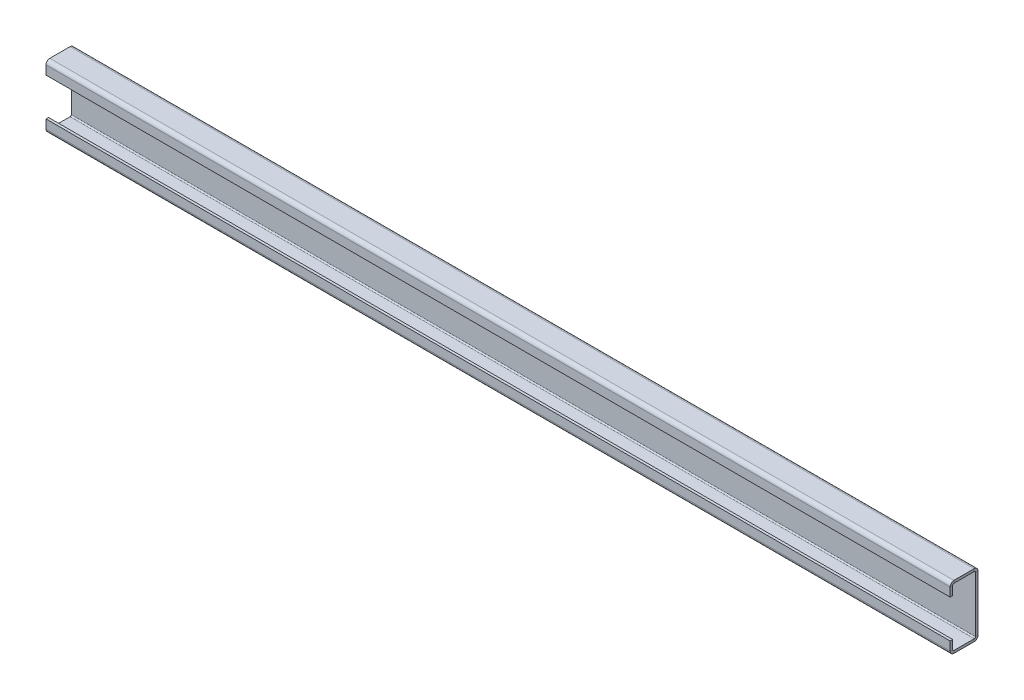
ISO-10303-21;
HEADER;
FILE_DESCRIPTION(('STEP AP214'),'2;1');
FILE_NAME('part.step','',(''),(''),'','','');
FILE_SCHEMA(('AUTOMOTIVE_DESIGN { 1 0 10303 214 1 1 1 1 }'));
ENDSEC;
DATA;
#1=APPLICATION_CONTEXT('core data for automotive mechanical design processes');
#2=APPLICATION_PROTOCOL_DEFINITION('international standard','automotive_design',2000,#1);
#3=PRODUCT_CONTEXT('',#1,'mechanical');
#4=PRODUCT('Part','Part','',(#3));
#5=PRODUCT_RELATED_PRODUCT_CATEGORY('part','',(#4));
#6=PRODUCT_DEFINITION_FORMATION('','',#4);
#7=PRODUCT_DEFINITION_CONTEXT('part definition',#1,'design');
#8=PRODUCT_DEFINITION('design','',#6,#7);
#9=PRODUCT_DEFINITION_SHAPE('','',#8);
#10=(LENGTH_UNIT() NAMED_UNIT(*) SI_UNIT(.MILLI.,.METRE.));
#11=(NAMED_UNIT(*) PLANE_ANGLE_UNIT() SI_UNIT($,.RADIAN.));
#12=(NAMED_UNIT(*) SI_UNIT($,.STERADIAN.) SOLID_ANGLE_UNIT());
#13=UNCERTAINTY_MEASURE_WITH_UNIT(LENGTH_MEASURE(1.E-05),#10,'distance_accuracy_value','');
#14=(GEOMETRIC_REPRESENTATION_CONTEXT(3) GLOBAL_UNCERTAINTY_ASSIGNED_CONTEXT((#13)) GLOBAL_UNIT_ASSIGNED_CONTEXT((#10,
#11,#12)) REPRESENTATION_CONTEXT('',''));
#15=CARTESIAN_POINT('',(0.,0.,0.));
#16=DIRECTION('',(0.,0.,1.));
#17=DIRECTION('',(1.,0.,0.));
#18=AXIS2_PLACEMENT_3D('',#15,#16,#17);
#19=CARTESIAN_POINT('',(357.5,-24.9999999999999,1.99999999999999));
#20=DIRECTION('',(-1.,0.,0.));
#21=DIRECTION('',(0.,-1.,0.));
#22=AXIS2_PLACEMENT_3D('',#19,#20,#21);
#23=PLANE('',#22);
#24=DIRECTION('',(0.,-1.,0.));
#25=VECTOR('',#24,1.);
#26=CARTESIAN_POINT('',(357.5,-23.,19.));
#27=LINE('',#26,#25);
#28=CARTESIAN_POINT('',(357.5,-23.,19.));
#29=VERTEX_POINT('',#28);
#30=CARTESIAN_POINT('',(357.5,-25.,19.));
#31=VERTEX_POINT('',#30);
#32=EDGE_CURVE('E311',#29,#31,#27,.T.);
#33=ORIENTED_EDGE('',*,*,#32,.T.);
#34=DIRECTION('',(0.,0.,-1.));
#35=VECTOR('',#34,1.);
#36=CARTESIAN_POINT('',(357.5,-24.9999999999998,0.));
#37=LINE('',#36,#35);
#38=CARTESIAN_POINT('',(357.5,-24.9999999999999,3.00000000000002));
#39=VERTEX_POINT('',#38);
#40=EDGE_CURVE('E377',#39,#31,#37,.F.);
#41=ORIENTED_EDGE('',*,*,#40,.F.);
#42=DIRECTION('',(0.,1.,0.));
#43=VECTOR('',#42,1.);
#44=CARTESIAN_POINT('',(357.5,-22.9999999999999,3.00000000000003));
#45=LINE('',#44,#43);
#46=CARTESIAN_POINT('',(357.5,-23.,3.00000000000001));
#47=VERTEX_POINT('',#46);
#48=EDGE_CURVE('E388',#47,#39,#45,.F.);
#49=ORIENTED_EDGE('',*,*,#48,.F.);
#50=DIRECTION('',(0.,0.,1.));
#51=VECTOR('',#50,1.);
#52=CARTESIAN_POINT('',(357.5,-22.9999999999999,2.));
#53=LINE('',#52,#51);
#54=EDGE_CURVE('E382',#47,#29,#53,.T.);
#55=ORIENTED_EDGE('',*,*,#54,.T.);
#56=EDGE_LOOP('',(#33,#41,#49,#55));
#57=FACE_BOUND('',#56,.T.);
#58=ADVANCED_FACE('F119',(#57),#23,.F.);
#59=CARTESIAN_POINT('',(-357.5,-25.,22.));
#60=DIRECTION('',(1.,0.,0.));
#61=DIRECTION('',(0.,1.,0.));
#62=AXIS2_PLACEMENT_3D('',#59,#60,#61);
#63=PLANE('',#62);
#64=DIRECTION('',(0.,-1.,0.));
#65=VECTOR('',#64,1.);
#66=CARTESIAN_POINT('',(-357.5,-23.,19.));
#67=LINE('',#66,#65);
#68=CARTESIAN_POINT('',(-357.5,-23.,19.));
#69=VERTEX_POINT('',#68);
#70=CARTESIAN_POINT('',(-357.5,-25.,19.));
#71=VERTEX_POINT('',#70);
#72=EDGE_CURVE('E318',#69,#71,#67,.T.);
#73=ORIENTED_EDGE('',*,*,#72,.F.);
#74=DIRECTION('',(0.,0.,-1.));
#75=VECTOR('',#74,1.);
#76=CARTESIAN_POINT('',(-357.5,-23.,22.));
#77=LINE('',#76,#75);
#78=CARTESIAN_POINT('',(-357.5,-23.,3.00000000000001));
#79=VERTEX_POINT('',#78);
#80=EDGE_CURVE('E380',#69,#79,#77,.T.);
#81=ORIENTED_EDGE('',*,*,#80,.T.);
#82=DIRECTION('',(0.,1.,0.));
#83=VECTOR('',#82,1.);
#84=CARTESIAN_POINT('',(-357.5,-25.,2.99999999999999));
#85=LINE('',#84,#83);
#86=CARTESIAN_POINT('',(-357.5,-25.,3.00000000000001));
#87=VERTEX_POINT('',#86);
#88=EDGE_CURVE('E371',#79,#87,#85,.F.);
#89=ORIENTED_EDGE('',*,*,#88,.T.);
#90=DIRECTION('',(0.,0.,1.));
#91=VECTOR('',#90,1.);
#92=CARTESIAN_POINT('',(-357.5,-25.,0.));
#93=LINE('',#92,#91);
#94=EDGE_CURVE('E374',#71,#87,#93,.F.);
#95=ORIENTED_EDGE('',*,*,#94,.F.);
#96=EDGE_LOOP('',(#73,#81,#89,#95));
#97=FACE_BOUND('',#96,.T.);
#98=ADVANCED_FACE('F547',(#97),#63,.F.);
#99=CARTESIAN_POINT('',(0.,-24.9999999999999,0.));
#100=DIRECTION('',(0.,-1.,0.));
#101=DIRECTION('',(0.,0.,-1.));
#102=AXIS2_PLACEMENT_3D('',#99,#100,#101);
#103=PLANE('',#102);
#104=ORIENTED_EDGE('',*,*,#40,.T.);
#105=DIRECTION('',(1.,0.,0.));
#106=VECTOR('',#105,1.);
#107=CARTESIAN_POINT('',(357.5,-25.,19.));
#108=LINE('',#107,#106);
#109=EDGE_CURVE('E262',#31,#71,#108,.F.);
#110=ORIENTED_EDGE('',*,*,#109,.T.);
#111=ORIENTED_EDGE('',*,*,#94,.T.);
#112=DIRECTION('',(1.,0.,0.));
#113=VECTOR('',#112,1.);
#114=CARTESIAN_POINT('',(0.,-24.9999999999999,3.00000000000001));
#115=LINE('',#114,#113);
#116=EDGE_CURVE('E385',#87,#39,#115,.T.);
#117=ORIENTED_EDGE('',*,*,#116,.T.);
#118=EDGE_LOOP('',(#104,#110,#111,#117));
#119=FACE_BOUND('',#118,.T.);
#120=ADVANCED_FACE('F553',(#119),#103,.T.);
#121=CARTESIAN_POINT('',(0.,-22.9999999999999,0.));
#122=DIRECTION('',(0.,-1.,0.));
#123=DIRECTION('',(0.,0.,-1.));
#124=AXIS2_PLACEMENT_3D('',#121,#122,#123);
#125=PLANE('',#124);
#126=DIRECTION('',(1.,0.,0.));
#127=VECTOR('',#126,1.);
#128=CARTESIAN_POINT('',(357.5,-23.,19.));
#129=LINE('',#128,#127);
#130=EDGE_CURVE('E315',#29,#69,#129,.F.);
#131=ORIENTED_EDGE('',*,*,#130,.F.);
#132=ORIENTED_EDGE('',*,*,#54,.F.);
#133=DIRECTION('',(-1.,0.,0.));
#134=VECTOR('',#133,1.);
#135=CARTESIAN_POINT('',(-357.5,-23.,3.));
#136=LINE('',#135,#134);
#137=EDGE_CURVE('E391',#79,#47,#136,.F.);
#138=ORIENTED_EDGE('',*,*,#137,.F.);
#139=ORIENTED_EDGE('',*,*,#80,.F.);
#140=EDGE_LOOP('',(#131,#132,#138,#139));
#141=FACE_BOUND('',#140,.T.);
#142=ADVANCED_FACE('F582',(#141),#125,.F.);
#143=CARTESIAN_POINT('',(-357.5,25.,1.99999999999999));
#144=DIRECTION('',(1.,0.,0.));
#145=DIRECTION('',(0.,1.,0.));
#146=AXIS2_PLACEMENT_3D('',#143,#144,#145);
#147=PLANE('',#146);
#148=DIRECTION('',(0.,1.,0.));
#149=VECTOR('',#148,1.);
#150=CARTESIAN_POINT('',(-357.5,23.0000000000001,19.));
#151=LINE('',#150,#149);
#152=CARTESIAN_POINT('',(-357.5,23.0000000000001,19.));
#153=VERTEX_POINT('',#152);
#154=CARTESIAN_POINT('',(-357.5,25.0000000000001,19.));
#155=VERTEX_POINT('',#154);
#156=EDGE_CURVE('E359',#153,#155,#151,.T.);
#157=ORIENTED_EDGE('',*,*,#156,.T.);
#158=DIRECTION('',(0.,0.,-1.));
#159=VECTOR('',#158,1.);
#160=CARTESIAN_POINT('',(-357.5,25.,0.));
#161=LINE('',#160,#159);
#162=CARTESIAN_POINT('',(-357.5,25.,3.00000000000002));
#163=VERTEX_POINT('',#162);
#164=EDGE_CURVE('E421',#163,#155,#161,.F.);
#165=ORIENTED_EDGE('',*,*,#164,.F.);
#166=DIRECTION('',(0.,-1.,0.));
#167=VECTOR('',#166,1.);
#168=CARTESIAN_POINT('',(-357.5,23.,3.00000000000003));
#169=LINE('',#168,#167);
#170=CARTESIAN_POINT('',(-357.5,23.0000000000001,3.00000000000001));
#171=VERTEX_POINT('',#170);
#172=EDGE_CURVE('E432',#171,#163,#169,.F.);
#173=ORIENTED_EDGE('',*,*,#172,.F.);
#174=DIRECTION('',(0.,0.,1.));
#175=VECTOR('',#174,1.);
#176=CARTESIAN_POINT('',(-357.5,23.,2.));
#177=LINE('',#176,#175);
#178=EDGE_CURVE('E426',#171,#153,#177,.T.);
#179=ORIENTED_EDGE('',*,*,#178,.T.);
#180=EDGE_LOOP('',(#157,#165,#173,#179));
#181=FACE_BOUND('',#180,.T.);
#182=ADVANCED_FACE('F505',(#181),#147,.F.);
#183=CARTESIAN_POINT('',(357.5,25.0000000000001,22.));
#184=DIRECTION('',(-1.,0.,0.));
#185=DIRECTION('',(0.,-1.,0.));
#186=AXIS2_PLACEMENT_3D('',#183,#184,#185);
#187=PLANE('',#186);
#188=DIRECTION('',(0.,1.,0.));
#189=VECTOR('',#188,1.);
#190=CARTESIAN_POINT('',(357.5,23.0000000000001,19.));
#191=LINE('',#190,#189);
#192=CARTESIAN_POINT('',(357.5,23.0000000000001,19.));
#193=VERTEX_POINT('',#192);
#194=CARTESIAN_POINT('',(357.5,25.0000000000001,19.));
#195=VERTEX_POINT('',#194);
#196=EDGE_CURVE('E369',#193,#195,#191,.T.);
#197=ORIENTED_EDGE('',*,*,#196,.F.);
#198=DIRECTION('',(0.,0.,-1.));
#199=VECTOR('',#198,1.);
#200=CARTESIAN_POINT('',(357.5,23.0000000000001,22.));
#201=LINE('',#200,#199);
#202=CARTESIAN_POINT('',(357.5,23.0000000000001,3.00000000000001));
#203=VERTEX_POINT('',#202);
#204=EDGE_CURVE('E424',#193,#203,#201,.T.);
#205=ORIENTED_EDGE('',*,*,#204,.T.);
#206=DIRECTION('',(0.,-1.,0.));
#207=VECTOR('',#206,1.);
#208=CARTESIAN_POINT('',(357.5,25.0000000000001,2.99999999999999));
#209=LINE('',#208,#207);
#210=CARTESIAN_POINT('',(357.5,25.0000000000001,3.00000000000001));
#211=VERTEX_POINT('',#210);
#212=EDGE_CURVE('E415',#203,#211,#209,.F.);
#213=ORIENTED_EDGE('',*,*,#212,.T.);
#214=DIRECTION('',(0.,0.,1.));
#215=VECTOR('',#214,1.);
#216=CARTESIAN_POINT('',(357.5,25.0000000000001,0.));
#217=LINE('',#216,#215);
#218=EDGE_CURVE('E418',#195,#211,#217,.F.);
#219=ORIENTED_EDGE('',*,*,#218,.F.);
#220=EDGE_LOOP('',(#197,#205,#213,#219));
#221=FACE_BOUND('',#220,.T.);
#222=ADVANCED_FACE('F497',(#221),#187,.F.);
#223=CARTESIAN_POINT('',(0.,25.,0.));
#224=DIRECTION('',(0.,1.,0.));
#225=DIRECTION('',(0.,0.,1.));
#226=AXIS2_PLACEMENT_3D('',#223,#224,#225);
#227=PLANE('',#226);
#228=ORIENTED_EDGE('',*,*,#164,.T.);
#229=DIRECTION('',(-1.,0.,0.));
#230=VECTOR('',#229,1.);
#231=CARTESIAN_POINT('',(-357.5,25.0000000000001,19.));
#232=LINE('',#231,#230);
#233=EDGE_CURVE('E354',#155,#195,#232,.F.);
#234=ORIENTED_EDGE('',*,*,#233,.T.);
#235=ORIENTED_EDGE('',*,*,#218,.T.);
#236=DIRECTION('',(-1.,0.,0.));
#237=VECTOR('',#236,1.);
#238=CARTESIAN_POINT('',(0.,25.,3.00000000000001));
#239=LINE('',#238,#237);
#240=EDGE_CURVE('E429',#211,#163,#239,.T.);
#241=ORIENTED_EDGE('',*,*,#240,.T.);
#242=EDGE_LOOP('',(#228,#234,#235,#241));
#243=FACE_BOUND('',#242,.T.);
#244=ADVANCED_FACE('F507',(#243),#227,.T.);
#245=CARTESIAN_POINT('',(0.,23.,0.));
#246=DIRECTION('',(0.,1.,0.));
#247=DIRECTION('',(0.,0.,1.));
#248=AXIS2_PLACEMENT_3D('',#245,#246,#247);
#249=PLANE('',#248);
#250=DIRECTION('',(-1.,0.,0.));
#251=VECTOR('',#250,1.);
#252=CARTESIAN_POINT('',(-357.5,23.0000000000001,19.));
#253=LINE('',#252,#251);
#254=EDGE_CURVE('E365',#153,#193,#253,.F.);
#255=ORIENTED_EDGE('',*,*,#254,.F.);
#256=ORIENTED_EDGE('',*,*,#178,.F.);
#257=DIRECTION('',(1.,0.,0.));
#258=VECTOR('',#257,1.);
#259=CARTESIAN_POINT('',(357.5,23.0000000000001,3.));
#260=LINE('',#259,#258);
#261=EDGE_CURVE('E435',#203,#171,#260,.F.);
#262=ORIENTED_EDGE('',*,*,#261,.F.);
#263=ORIENTED_EDGE('',*,*,#204,.F.);
#264=EDGE_LOOP('',(#255,#256,#262,#263));
#265=FACE_BOUND('',#264,.T.);
#266=ADVANCED_FACE('F501',(#265),#249,.F.);
#267=CARTESIAN_POINT('',(-357.5,25.,2.));
#268=DIRECTION('',(1.,0.,0.));
#269=DIRECTION('',(0.,1.,0.));
#270=AXIS2_PLACEMENT_3D('',#267,#268,#269);
#271=PLANE('',#270);
#272=DIRECTION('',(0.,0.,-1.));
#273=VECTOR('',#272,1.);
#274=CARTESIAN_POINT('',(-357.5,-21.9999999999999,1.99999999999996));
#275=LINE('',#274,#273);
#276=CARTESIAN_POINT('',(-357.5,-21.9999999999999,1.99999999999996));
#277=VERTEX_POINT('',#276);
#278=CARTESIAN_POINT('',(-357.5,-21.9999999999998,0.));
#279=VERTEX_POINT('',#278);
#280=EDGE_CURVE('E412',#277,#279,#275,.T.);
#281=ORIENTED_EDGE('',*,*,#280,.F.);
#282=DIRECTION('',(0.,-1.,0.));
#283=VECTOR('',#282,1.);
#284=CARTESIAN_POINT('',(-357.5,25.,2.));
#285=LINE('',#284,#283);
#286=CARTESIAN_POINT('',(-357.5,22.,1.99999999999996));
#287=VERTEX_POINT('',#286);
#288=EDGE_CURVE('E128',#287,#277,#285,.T.);
#289=ORIENTED_EDGE('',*,*,#288,.F.);
#290=DIRECTION('',(0.,0.,-1.));
#291=VECTOR('',#290,1.);
#292=CARTESIAN_POINT('',(-357.5,22.,1.99999999999996));
#293=LINE('',#292,#291);
#294=CARTESIAN_POINT('',(-357.5,21.9999999999999,0.));
#295=VERTEX_POINT('',#294);
#296=EDGE_CURVE('E446',#287,#295,#293,.T.);
#297=ORIENTED_EDGE('',*,*,#296,.T.);
#298=DIRECTION('',(0.,-1.,0.));
#299=VECTOR('',#298,1.);
#300=CARTESIAN_POINT('',(-357.5,25.,0.));
#301=LINE('',#300,#299);
#302=EDGE_CURVE('E459',#295,#279,#301,.T.);
#303=ORIENTED_EDGE('',*,*,#302,.T.);
#304=EDGE_LOOP('',(#281,#289,#297,#303));
#305=FACE_BOUND('',#304,.T.);
#306=ADVANCED_FACE('F121',(#305),#271,.F.);
#307=CARTESIAN_POINT('',(357.5,25.0000000000001,2.));
#308=DIRECTION('',(-1.,0.,0.));
#309=DIRECTION('',(0.,0.,1.));
#310=AXIS2_PLACEMENT_3D('',#307,#308,#309);
#311=PLANE('',#310);
#312=DIRECTION('',(0.,0.,-1.));
#313=VECTOR('',#312,1.);
#314=CARTESIAN_POINT('',(357.5,-21.9999999999999,1.99999999999996));
#315=LINE('',#314,#313);
#316=CARTESIAN_POINT('',(357.5,-21.9999999999999,1.99999999999996));
#317=VERTEX_POINT('',#316);
#318=CARTESIAN_POINT('',(357.5,-21.9999999999997,0.));
#319=VERTEX_POINT('',#318);
#320=EDGE_CURVE('E402',#317,#319,#315,.T.);
#321=ORIENTED_EDGE('',*,*,#320,.T.);
#322=DIRECTION('',(0.,1.,0.));
#323=VECTOR('',#322,1.);
#324=CARTESIAN_POINT('',(357.5,25.0000000000001,0.));
#325=LINE('',#324,#323);
#326=CARTESIAN_POINT('',(357.5,22.,0.));
#327=VERTEX_POINT('',#326);
#328=EDGE_CURVE('E123',#319,#327,#325,.T.);
#329=ORIENTED_EDGE('',*,*,#328,.T.);
#330=DIRECTION('',(0.,0.,-1.));
#331=VECTOR('',#330,1.);
#332=CARTESIAN_POINT('',(357.5,22.,1.99999999999996));
#333=LINE('',#332,#331);
#334=CARTESIAN_POINT('',(357.5,22.,1.99999999999996));
#335=VERTEX_POINT('',#334);
#336=EDGE_CURVE('E456',#335,#327,#333,.T.);
#337=ORIENTED_EDGE('',*,*,#336,.F.);
#338=DIRECTION('',(0.,1.,0.));
#339=VECTOR('',#338,1.);
#340=CARTESIAN_POINT('',(357.5,25.0000000000001,2.));
#341=LINE('',#340,#339);
#342=EDGE_CURVE('E13',#317,#335,#341,.T.);
#343=ORIENTED_EDGE('',*,*,#342,.F.);
#344=EDGE_LOOP('',(#321,#329,#337,#343));
#345=FACE_BOUND('',#344,.T.);
#346=ADVANCED_FACE('F471',(#345),#311,.F.);
#347=CARTESIAN_POINT('',(0.,0.,2.));
#348=DIRECTION('',(0.,0.,-1.));
#349=DIRECTION('',(-1.,0.,0.));
#350=AXIS2_PLACEMENT_3D('',#347,#348,#349);
#351=PLANE('',#350);
#352=DIRECTION('',(1.,0.,0.));
#353=VECTOR('',#352,1.);
#354=CARTESIAN_POINT('',(357.5,-21.9999999999999,1.99999999999996));
#355=LINE('',#354,#353);
#356=EDGE_CURVE('E408',#317,#277,#355,.F.);
#357=ORIENTED_EDGE('',*,*,#356,.F.);
#358=ORIENTED_EDGE('',*,*,#342,.T.);
#359=DIRECTION('',(-1.,0.,0.));
#360=VECTOR('',#359,1.);
#361=CARTESIAN_POINT('',(-357.5,22.,1.99999999999996));
#362=LINE('',#361,#360);
#363=EDGE_CURVE('E452',#287,#335,#362,.F.);
#364=ORIENTED_EDGE('',*,*,#363,.F.);
#365=ORIENTED_EDGE('',*,*,#288,.T.);
#366=EDGE_LOOP('',(#357,#358,#364,#365));
#367=FACE_BOUND('',#366,.T.);
#368=ADVANCED_FACE('F486',(#367),#351,.F.);
#369=CARTESIAN_POINT('',(0.,0.,0.));
#370=DIRECTION('',(0.,0.,-1.));
#371=DIRECTION('',(-1.,0.,0.));
#372=AXIS2_PLACEMENT_3D('',#369,#370,#371);
#373=PLANE('',#372);
#374=ORIENTED_EDGE('',*,*,#328,.F.);
#375=DIRECTION('',(1.,0.,0.));
#376=VECTOR('',#375,1.);
#377=CARTESIAN_POINT('',(357.5,-21.9999999999997,0.));
#378=LINE('',#377,#376);
#379=EDGE_CURVE('E395',#319,#279,#378,.F.);
#380=ORIENTED_EDGE('',*,*,#379,.T.);
#381=ORIENTED_EDGE('',*,*,#302,.F.);
#382=DIRECTION('',(-1.,0.,0.));
#383=VECTOR('',#382,1.);
#384=CARTESIAN_POINT('',(-357.5,21.9999999999999,0.));
#385=LINE('',#384,#383);
#386=EDGE_CURVE('E439',#295,#327,#385,.F.);
#387=ORIENTED_EDGE('',*,*,#386,.T.);
#388=EDGE_LOOP('',(#374,#380,#381,#387));
#389=FACE_BOUND('',#388,.T.);
#390=ADVANCED_FACE('F474',(#389),#373,.T.);
#391=CARTESIAN_POINT('',(357.5,22.,3.00000000000002));
#392=DIRECTION('',(1.,0.,0.));
#393=DIRECTION('',(0.,0.,-1.));
#394=AXIS2_PLACEMENT_3D('',#391,#392,#393);
#395=PLANE('',#394);
#396=ORIENTED_EDGE('',*,*,#212,.F.);
#397=CARTESIAN_POINT('',(357.5,22.,3.00000000000002));
#398=DIRECTION('',(-1.,0.,0.));
#399=DIRECTION('',(0.,0.,1.));
#400=AXIS2_PLACEMENT_3D('',#397,#398,#399);
#401=CIRCLE('',#400,1.00000000000006);
#402=EDGE_CURVE('E449',#335,#203,#401,.F.);
#403=ORIENTED_EDGE('',*,*,#402,.F.);
#404=ORIENTED_EDGE('',*,*,#336,.T.);
#405=CARTESIAN_POINT('',(357.5,22.,3.00000000000002));
#406=DIRECTION('',(-1.,0.,0.));
#407=DIRECTION('',(0.,0.,1.));
#408=AXIS2_PLACEMENT_3D('',#405,#406,#407);
#409=CIRCLE('',#408,3.00000000000006);
#410=EDGE_CURVE('E442',#327,#211,#409,.F.);
#411=ORIENTED_EDGE('',*,*,#410,.T.);
#412=EDGE_LOOP('',(#396,#403,#404,#411));
#413=FACE_BOUND('',#412,.T.);
#414=ADVANCED_FACE('F493',(#413),#395,.T.);
#415=CARTESIAN_POINT('',(-357.5,22.,3.00000000000002));
#416=DIRECTION('',(1.,0.,0.));
#417=DIRECTION('',(0.,0.,-1.));
#418=AXIS2_PLACEMENT_3D('',#415,#416,#417);
#419=PLANE('',#418);
#420=CARTESIAN_POINT('',(-357.5,22.,3.00000000000002));
#421=DIRECTION('',(-1.,0.,0.));
#422=DIRECTION('',(0.,0.,1.));
#423=AXIS2_PLACEMENT_3D('',#420,#421,#422);
#424=CIRCLE('',#423,1.00000000000006);
#425=EDGE_CURVE('E420',#171,#287,#424,.T.);
#426=ORIENTED_EDGE('',*,*,#425,.F.);
#427=ORIENTED_EDGE('',*,*,#172,.T.);
#428=CARTESIAN_POINT('',(-357.5,22.,3.00000000000002));
#429=DIRECTION('',(-1.,0.,0.));
#430=DIRECTION('',(0.,0.,1.));
#431=AXIS2_PLACEMENT_3D('',#428,#429,#430);
#432=CIRCLE('',#431,3.00000000000006);
#433=EDGE_CURVE('E443',#163,#295,#432,.T.);
#434=ORIENTED_EDGE('',*,*,#433,.T.);
#435=ORIENTED_EDGE('',*,*,#296,.F.);
#436=EDGE_LOOP('',(#426,#427,#434,#435));
#437=FACE_BOUND('',#436,.T.);
#438=ADVANCED_FACE('F480',(#437),#419,.F.);
#439=CARTESIAN_POINT('',(-357.5,22.,3.00000000000002));
#440=DIRECTION('',(-1.,0.,0.));
#441=DIRECTION('',(0.,1.,0.));
#442=AXIS2_PLACEMENT_3D('',#439,#440,#441);
#443=CYLINDRICAL_SURFACE('',#442,3.00000000000006);
#444=ORIENTED_EDGE('',*,*,#386,.F.);
#445=ORIENTED_EDGE('',*,*,#433,.F.);
#446=ORIENTED_EDGE('',*,*,#240,.F.);
#447=ORIENTED_EDGE('',*,*,#410,.F.);
#448=EDGE_LOOP('',(#444,#445,#446,#447));
#449=FACE_BOUND('',#448,.T.);
#450=ADVANCED_FACE('F476',(#449),#443,.T.);
#451=CARTESIAN_POINT('',(-357.5,22.,3.00000000000002));
#452=DIRECTION('',(-1.,0.,0.));
#453=DIRECTION('',(0.,1.,0.));
#454=AXIS2_PLACEMENT_3D('',#451,#452,#453);
#455=CYLINDRICAL_SURFACE('',#454,1.00000000000006);
#456=ORIENTED_EDGE('',*,*,#363,.T.);
#457=ORIENTED_EDGE('',*,*,#402,.T.);
#458=ORIENTED_EDGE('',*,*,#261,.T.);
#459=ORIENTED_EDGE('',*,*,#425,.T.);
#460=EDGE_LOOP('',(#456,#457,#458,#459));
#461=FACE_BOUND('',#460,.T.);
#462=ADVANCED_FACE('F489',(#461),#455,.F.);
#463=CARTESIAN_POINT('',(-357.5,-21.9999999999999,3.00000000000002));
#464=DIRECTION('',(-1.,0.,0.));
#465=DIRECTION('',(0.,0.,1.));
#466=AXIS2_PLACEMENT_3D('',#463,#464,#465);
#467=PLANE('',#466);
#468=ORIENTED_EDGE('',*,*,#88,.F.);
#469=CARTESIAN_POINT('',(-357.5,-21.9999999999999,3.00000000000002));
#470=DIRECTION('',(1.,0.,0.));
#471=DIRECTION('',(0.,0.,-1.));
#472=AXIS2_PLACEMENT_3D('',#469,#470,#471);
#473=CIRCLE('',#472,1.00000000000006);
#474=EDGE_CURVE('E405',#277,#79,#473,.F.);
#475=ORIENTED_EDGE('',*,*,#474,.F.);
#476=ORIENTED_EDGE('',*,*,#280,.T.);
#477=CARTESIAN_POINT('',(-357.5,-21.9999999999999,3.00000000000002));
#478=DIRECTION('',(1.,0.,0.));
#479=DIRECTION('',(0.,0.,-1.));
#480=AXIS2_PLACEMENT_3D('',#477,#478,#479);
#481=CIRCLE('',#480,3.00000000000006);
#482=EDGE_CURVE('E398',#279,#87,#481,.F.);
#483=ORIENTED_EDGE('',*,*,#482,.T.);
#484=EDGE_LOOP('',(#468,#475,#476,#483));
#485=FACE_BOUND('',#484,.T.);
#486=ADVANCED_FACE('F567',(#485),#467,.T.);
#487=CARTESIAN_POINT('',(357.5,-21.9999999999999,3.00000000000002));
#488=DIRECTION('',(-1.,0.,0.));
#489=DIRECTION('',(0.,0.,1.));
#490=AXIS2_PLACEMENT_3D('',#487,#488,#489);
#491=PLANE('',#490);
#492=CARTESIAN_POINT('',(357.5,-21.9999999999999,3.00000000000002));
#493=DIRECTION('',(1.,0.,0.));
#494=DIRECTION('',(0.,0.,-1.));
#495=AXIS2_PLACEMENT_3D('',#492,#493,#494);
#496=CIRCLE('',#495,1.00000000000006);
#497=EDGE_CURVE('E376',#47,#317,#496,.T.);
#498=ORIENTED_EDGE('',*,*,#497,.F.);
#499=ORIENTED_EDGE('',*,*,#48,.T.);
#500=CARTESIAN_POINT('',(357.5,-21.9999999999999,3.00000000000002));
#501=DIRECTION('',(1.,0.,0.));
#502=DIRECTION('',(0.,0.,-1.));
#503=AXIS2_PLACEMENT_3D('',#500,#501,#502);
#504=CIRCLE('',#503,3.00000000000006);
#505=EDGE_CURVE('E399',#39,#319,#504,.T.);
#506=ORIENTED_EDGE('',*,*,#505,.T.);
#507=ORIENTED_EDGE('',*,*,#320,.F.);
#508=EDGE_LOOP('',(#498,#499,#506,#507));
#509=FACE_BOUND('',#508,.T.);
#510=ADVANCED_FACE('F562',(#509),#491,.F.);
#511=CARTESIAN_POINT('',(357.5,-21.9999999999999,3.00000000000002));
#512=DIRECTION('',(1.,0.,0.));
#513=DIRECTION('',(0.,-1.,0.));
#514=AXIS2_PLACEMENT_3D('',#511,#512,#513);
#515=CYLINDRICAL_SURFACE('',#514,3.00000000000006);
#516=ORIENTED_EDGE('',*,*,#379,.F.);
#517=ORIENTED_EDGE('',*,*,#505,.F.);
#518=ORIENTED_EDGE('',*,*,#116,.F.);
#519=ORIENTED_EDGE('',*,*,#482,.F.);
#520=EDGE_LOOP('',(#516,#517,#518,#519));
#521=FACE_BOUND('',#520,.T.);
#522=ADVANCED_FACE('F558',(#521),#515,.T.);
#523=CARTESIAN_POINT('',(357.5,-21.9999999999999,3.00000000000002));
#524=DIRECTION('',(1.,0.,0.));
#525=DIRECTION('',(0.,-1.,0.));
#526=AXIS2_PLACEMENT_3D('',#523,#524,#525);
#527=CYLINDRICAL_SURFACE('',#526,1.00000000000006);
#528=ORIENTED_EDGE('',*,*,#356,.T.);
#529=ORIENTED_EDGE('',*,*,#474,.T.);
#530=ORIENTED_EDGE('',*,*,#137,.T.);
#531=ORIENTED_EDGE('',*,*,#497,.T.);
#532=EDGE_LOOP('',(#528,#529,#530,#531));
#533=FACE_BOUND('',#532,.T.);
#534=ADVANCED_FACE('F561',(#533),#527,.F.);
#535=CARTESIAN_POINT('',(357.5,22.0000000000001,19.));
#536=DIRECTION('',(1.,0.,0.));
#537=DIRECTION('',(0.,0.,-1.));
#538=AXIS2_PLACEMENT_3D('',#535,#536,#537);
#539=PLANE('',#538);
#540=DIRECTION('',(0.,0.,1.));
#541=VECTOR('',#540,1.);
#542=CARTESIAN_POINT('',(357.5,22.0000000000001,22.0000000000001));
#543=LINE('',#542,#541);
#544=CARTESIAN_POINT('',(357.5,22.0000000000001,20.));
#545=VERTEX_POINT('',#544);
#546=CARTESIAN_POINT('',(357.5,22.0000000000001,22.));
#547=VERTEX_POINT('',#546);
#548=EDGE_CURVE('E320',#545,#547,#543,.T.);
#549=ORIENTED_EDGE('',*,*,#548,.F.);
#550=CARTESIAN_POINT('',(357.5,22.0000000000001,19.));
#551=DIRECTION('',(-1.,0.,0.));
#552=DIRECTION('',(0.,0.,1.));
#553=AXIS2_PLACEMENT_3D('',#550,#551,#552);
#554=CIRCLE('',#553,1.);
#555=EDGE_CURVE('E362',#193,#545,#554,.F.);
#556=ORIENTED_EDGE('',*,*,#555,.F.);
#557=ORIENTED_EDGE('',*,*,#196,.T.);
#558=CARTESIAN_POINT('',(357.5,22.0000000000001,19.));
#559=DIRECTION('',(-1.,0.,0.));
#560=DIRECTION('',(0.,0.,1.));
#561=AXIS2_PLACEMENT_3D('',#558,#559,#560);
#562=CIRCLE('',#561,3.);
#563=EDGE_CURVE('E144',#195,#547,#562,.F.);
#564=ORIENTED_EDGE('',*,*,#563,.T.);
#565=EDGE_LOOP('',(#549,#556,#557,#564));
#566=FACE_BOUND('',#565,.T.);
#567=ADVANCED_FACE('F530',(#566),#539,.T.);
#568=CARTESIAN_POINT('',(-357.5,22.0000000000001,19.));
#569=DIRECTION('',(1.,0.,0.));
#570=DIRECTION('',(0.,0.,-1.));
#571=AXIS2_PLACEMENT_3D('',#568,#569,#570);
#572=PLANE('',#571);
#573=CARTESIAN_POINT('',(-357.5,22.0000000000001,19.));
#574=DIRECTION('',(-1.,0.,0.));
#575=DIRECTION('',(0.,0.,1.));
#576=AXIS2_PLACEMENT_3D('',#573,#574,#575);
#577=CIRCLE('',#576,1.);
#578=CARTESIAN_POINT('',(-357.5,22.0000000000001,20.));
#579=VERTEX_POINT('',#578);
#580=EDGE_CURVE('E324',#579,#153,#577,.T.);
#581=ORIENTED_EDGE('',*,*,#580,.F.);
#582=DIRECTION('',(0.,0.,1.));
#583=VECTOR('',#582,1.);
#584=CARTESIAN_POINT('',(-357.5,22.,20.));
#585=LINE('',#584,#583);
#586=CARTESIAN_POINT('',(-357.5,22.,22.));
#587=VERTEX_POINT('',#586);
#588=EDGE_CURVE('E347',#579,#587,#585,.T.);
#589=ORIENTED_EDGE('',*,*,#588,.T.);
#590=CARTESIAN_POINT('',(-357.5,22.0000000000001,19.));
#591=DIRECTION('',(-1.,0.,0.));
#592=DIRECTION('',(0.,0.,1.));
#593=AXIS2_PLACEMENT_3D('',#590,#591,#592);
#594=CIRCLE('',#593,3.);
#595=EDGE_CURVE('E357',#587,#155,#594,.T.);
#596=ORIENTED_EDGE('',*,*,#595,.T.);
#597=ORIENTED_EDGE('',*,*,#156,.F.);
#598=EDGE_LOOP('',(#581,#589,#596,#597));
#599=FACE_BOUND('',#598,.T.);
#600=ADVANCED_FACE('F511',(#599),#572,.F.);
#601=CARTESIAN_POINT('',(-357.5,22.0000000000001,19.));
#602=DIRECTION('',(-1.,0.,0.));
#603=DIRECTION('',(0.,0.,1.));
#604=AXIS2_PLACEMENT_3D('',#601,#602,#603);
#605=CYLINDRICAL_SURFACE('',#604,3.);
#606=ORIENTED_EDGE('',*,*,#233,.F.);
#607=ORIENTED_EDGE('',*,*,#595,.F.);
#608=DIRECTION('',(-1.,0.,0.));
#609=VECTOR('',#608,1.);
#610=CARTESIAN_POINT('',(0.,22.0000000000001,22.));
#611=LINE('',#610,#609);
#612=EDGE_CURVE('E344',#547,#587,#611,.T.);
#613=ORIENTED_EDGE('',*,*,#612,.F.);
#614=ORIENTED_EDGE('',*,*,#563,.F.);
#615=EDGE_LOOP('',(#606,#607,#613,#614));
#616=FACE_BOUND('',#615,.T.);
#617=ADVANCED_FACE('F508',(#616),#605,.T.);
#618=CARTESIAN_POINT('',(-357.5,22.0000000000001,19.));
#619=DIRECTION('',(-1.,0.,0.));
#620=DIRECTION('',(0.,0.,1.));
#621=AXIS2_PLACEMENT_3D('',#618,#619,#620);
#622=CYLINDRICAL_SURFACE('',#621,1.);
#623=ORIENTED_EDGE('',*,*,#254,.T.);
#624=ORIENTED_EDGE('',*,*,#555,.T.);
#625=DIRECTION('',(1.,0.,0.));
#626=VECTOR('',#625,1.);
#627=CARTESIAN_POINT('',(357.5,22.0000000000001,20.));
#628=LINE('',#627,#626);
#629=EDGE_CURVE('E350',#545,#579,#628,.F.);
#630=ORIENTED_EDGE('',*,*,#629,.T.);
#631=ORIENTED_EDGE('',*,*,#580,.T.);
#632=EDGE_LOOP('',(#623,#624,#630,#631));
#633=FACE_BOUND('',#632,.T.);
#634=ADVANCED_FACE('F533',(#633),#622,.F.);
#635=CARTESIAN_POINT('',(-357.5,23.,22.));
#636=DIRECTION('',(-1.,0.,0.));
#637=DIRECTION('',(0.,0.,1.));
#638=AXIS2_PLACEMENT_3D('',#635,#636,#637);
#639=PLANE('',#638);
#640=DIRECTION('',(0.,1.,0.));
#641=VECTOR('',#640,1.);
#642=CARTESIAN_POINT('',(-357.5,23.,22.));
#643=LINE('',#642,#641);
#644=CARTESIAN_POINT('',(-357.5,15.,22.0000000000001));
#645=VERTEX_POINT('',#644);
#646=EDGE_CURVE('E328',#645,#587,#643,.T.);
#647=ORIENTED_EDGE('',*,*,#646,.T.);
#648=ORIENTED_EDGE('',*,*,#588,.F.);
#649=DIRECTION('',(0.,-1.,0.));
#650=VECTOR('',#649,1.);
#651=CARTESIAN_POINT('',(-357.5,1.45716771982053E-13,20.0000000000002));
#652=LINE('',#651,#650);
#653=CARTESIAN_POINT('',(-357.5,15.,20.0000000000001));
#654=VERTEX_POINT('',#653);
#655=EDGE_CURVE('E336',#654,#579,#652,.F.);
#656=ORIENTED_EDGE('',*,*,#655,.F.);
#657=DIRECTION('',(0.,0.,-1.));
#658=VECTOR('',#657,1.);
#659=CARTESIAN_POINT('',(-357.5,15.,22.0000000000001));
#660=LINE('',#659,#658);
#661=EDGE_CURVE('E322',#645,#654,#660,.T.);
#662=ORIENTED_EDGE('',*,*,#661,.F.);
#663=EDGE_LOOP('',(#647,#648,#656,#662));
#664=FACE_BOUND('',#663,.T.);
#665=ADVANCED_FACE('F520',(#664),#639,.T.);
#666=CARTESIAN_POINT('',(357.5,15.0000000000001,22.0000000000001));
#667=DIRECTION('',(1.,0.,0.));
#668=DIRECTION('',(0.,0.,-1.));
#669=AXIS2_PLACEMENT_3D('',#666,#667,#668);
#670=PLANE('',#669);
#671=DIRECTION('',(0.,1.,0.));
#672=VECTOR('',#671,1.);
#673=CARTESIAN_POINT('',(357.5,1.45716771982053E-13,20.0000000000002));
#674=LINE('',#673,#672);
#675=CARTESIAN_POINT('',(357.5,15.0000000000001,20.0000000000001));
#676=VERTEX_POINT('',#675);
#677=EDGE_CURVE('E342',#545,#676,#674,.F.);
#678=ORIENTED_EDGE('',*,*,#677,.F.);
#679=ORIENTED_EDGE('',*,*,#548,.T.);
#680=DIRECTION('',(0.,-1.,0.));
#681=VECTOR('',#680,1.);
#682=CARTESIAN_POINT('',(357.5,15.0000000000001,22.0000000000001));
#683=LINE('',#682,#681);
#684=CARTESIAN_POINT('',(357.5,15.0000000000001,22.0000000000001));
#685=VERTEX_POINT('',#684);
#686=EDGE_CURVE('E334',#547,#685,#683,.T.);
#687=ORIENTED_EDGE('',*,*,#686,.T.);
#688=DIRECTION('',(0.,0.,-1.));
#689=VECTOR('',#688,1.);
#690=CARTESIAN_POINT('',(357.5,15.0000000000001,22.0000000000001));
#691=LINE('',#690,#689);
#692=EDGE_CURVE('E325',#685,#676,#691,.T.);
#693=ORIENTED_EDGE('',*,*,#692,.T.);
#694=EDGE_LOOP('',(#678,#679,#687,#693));
#695=FACE_BOUND('',#694,.T.);
#696=ADVANCED_FACE('F527',(#695),#670,.T.);
#697=CARTESIAN_POINT('',(0.,1.59638628563646E-13,22.0000000000002));
#698=DIRECTION('',(0.,0.,1.));
#699=DIRECTION('',(0.,-1.,0.));
#700=AXIS2_PLACEMENT_3D('',#697,#698,#699);
#701=PLANE('',#700);
#702=ORIENTED_EDGE('',*,*,#686,.F.);
#703=ORIENTED_EDGE('',*,*,#612,.T.);
#704=ORIENTED_EDGE('',*,*,#646,.F.);
#705=DIRECTION('',(-1.,0.,0.));
#706=VECTOR('',#705,1.);
#707=CARTESIAN_POINT('',(-357.5,15.,22.0000000000001));
#708=LINE('',#707,#706);
#709=EDGE_CURVE('E331',#685,#645,#708,.T.);
#710=ORIENTED_EDGE('',*,*,#709,.F.);
#711=EDGE_LOOP('',(#702,#703,#704,#710));
#712=FACE_BOUND('',#711,.T.);
#713=ADVANCED_FACE('F518',(#712),#701,.T.);
#714=CARTESIAN_POINT('',(0.,1.45716771982053E-13,20.0000000000002));
#715=DIRECTION('',(0.,0.,1.));
#716=DIRECTION('',(0.,-1.,0.));
#717=AXIS2_PLACEMENT_3D('',#714,#715,#716);
#718=PLANE('',#717);
#719=ORIENTED_EDGE('',*,*,#629,.F.);
#720=ORIENTED_EDGE('',*,*,#677,.T.);
#721=DIRECTION('',(1.,0.,0.));
#722=VECTOR('',#721,1.);
#723=CARTESIAN_POINT('',(0.,15.0000000000001,20.0000000000001));
#724=LINE('',#723,#722);
#725=EDGE_CURVE('E339',#676,#654,#724,.F.);
#726=ORIENTED_EDGE('',*,*,#725,.T.);
#727=ORIENTED_EDGE('',*,*,#655,.T.);
#728=EDGE_LOOP('',(#719,#720,#726,#727));
#729=FACE_BOUND('',#728,.T.);
#730=ADVANCED_FACE('F535',(#729),#718,.F.);
#731=CARTESIAN_POINT('',(-357.5,15.,22.0000000000001));
#732=DIRECTION('',(0.,-1.,0.));
#733=DIRECTION('',(0.,0.,-1.));
#734=AXIS2_PLACEMENT_3D('',#731,#732,#733);
#735=PLANE('',#734);
#736=ORIENTED_EDGE('',*,*,#725,.F.);
#737=ORIENTED_EDGE('',*,*,#692,.F.);
#738=ORIENTED_EDGE('',*,*,#709,.T.);
#739=ORIENTED_EDGE('',*,*,#661,.T.);
#740=EDGE_LOOP('',(#736,#737,#738,#739));
#741=FACE_BOUND('',#740,.T.);
#742=ADVANCED_FACE('F524',(#741),#735,.T.);
#743=CARTESIAN_POINT('',(-357.5,-22.,19.));
#744=DIRECTION('',(-1.,0.,0.));
#745=DIRECTION('',(0.,0.,1.));
#746=AXIS2_PLACEMENT_3D('',#743,#744,#745);
#747=PLANE('',#746);
#748=DIRECTION('',(0.,0.,1.));
#749=VECTOR('',#748,1.);
#750=CARTESIAN_POINT('',(-357.5,-22.,22.0000000000001));
#751=LINE('',#750,#749);
#752=CARTESIAN_POINT('',(-357.5,-22.,20.));
#753=VERTEX_POINT('',#752);
#754=CARTESIAN_POINT('',(-357.5,-22.,22.));
#755=VERTEX_POINT('',#754);
#756=EDGE_CURVE('E307',#753,#755,#751,.T.);
#757=ORIENTED_EDGE('',*,*,#756,.F.);
#758=CARTESIAN_POINT('',(-357.5,-22.,19.));
#759=DIRECTION('',(1.,0.,0.));
#760=DIRECTION('',(0.,0.,-1.));
#761=AXIS2_PLACEMENT_3D('',#758,#759,#760);
#762=CIRCLE('',#761,1.);
#763=EDGE_CURVE('E265',#69,#753,#762,.F.);
#764=ORIENTED_EDGE('',*,*,#763,.F.);
#765=ORIENTED_EDGE('',*,*,#72,.T.);
#766=CARTESIAN_POINT('',(-357.5,-22.,19.));
#767=DIRECTION('',(1.,0.,0.));
#768=DIRECTION('',(0.,0.,-1.));
#769=AXIS2_PLACEMENT_3D('',#766,#767,#768);
#770=CIRCLE('',#769,3.);
#771=EDGE_CURVE('E136',#71,#755,#770,.F.);
#772=ORIENTED_EDGE('',*,*,#771,.T.);
#773=EDGE_LOOP('',(#757,#764,#765,#772));
#774=FACE_BOUND('',#773,.T.);
#775=ADVANCED_FACE('F542',(#774),#747,.T.);
#776=CARTESIAN_POINT('',(357.5,-22.,19.));
#777=DIRECTION('',(-1.,0.,0.));
#778=DIRECTION('',(0.,0.,1.));
#779=AXIS2_PLACEMENT_3D('',#776,#777,#778);
#780=PLANE('',#779);
#781=CARTESIAN_POINT('',(357.5,-22.,19.));
#782=DIRECTION('',(1.,0.,0.));
#783=DIRECTION('',(0.,0.,-1.));
#784=AXIS2_PLACEMENT_3D('',#781,#782,#783);
#785=CIRCLE('',#784,1.);
#786=CARTESIAN_POINT('',(357.5,-22.,20.));
#787=VERTEX_POINT('',#786);
#788=EDGE_CURVE('E272',#787,#29,#785,.T.);
#789=ORIENTED_EDGE('',*,*,#788,.F.);
#790=DIRECTION('',(0.,0.,1.));
#791=VECTOR('',#790,1.);
#792=CARTESIAN_POINT('',(357.5,-21.9999999999999,20.));
#793=LINE('',#792,#791);
#794=CARTESIAN_POINT('',(357.5,-21.9999999999999,22.));
#795=VERTEX_POINT('',#794);
#796=EDGE_CURVE('E269',#787,#795,#793,.T.);
#797=ORIENTED_EDGE('',*,*,#796,.T.);
#798=CARTESIAN_POINT('',(357.5,-22.,19.));
#799=DIRECTION('',(1.,0.,0.));
#800=DIRECTION('',(0.,0.,-1.));
#801=AXIS2_PLACEMENT_3D('',#798,#799,#800);
#802=CIRCLE('',#801,3.);
#803=EDGE_CURVE('E256',#795,#31,#802,.T.);
#804=ORIENTED_EDGE('',*,*,#803,.T.);
#805=ORIENTED_EDGE('',*,*,#32,.F.);
#806=EDGE_LOOP('',(#789,#797,#804,#805));
#807=FACE_BOUND('',#806,.T.);
#808=ADVANCED_FACE('F270',(#807),#780,.F.);
#809=CARTESIAN_POINT('',(357.5,-22.,19.));
#810=DIRECTION('',(1.,0.,0.));
#811=DIRECTION('',(0.,0.,1.));
#812=AXIS2_PLACEMENT_3D('',#809,#810,#811);
#813=CYLINDRICAL_SURFACE('',#812,3.);
#814=ORIENTED_EDGE('',*,*,#109,.F.);
#815=ORIENTED_EDGE('',*,*,#803,.F.);
#816=DIRECTION('',(1.,0.,0.));
#817=VECTOR('',#816,1.);
#818=CARTESIAN_POINT('',(0.,-22.,22.));
#819=LINE('',#818,#817);
#820=EDGE_CURVE('E260',#755,#795,#819,.T.);
#821=ORIENTED_EDGE('',*,*,#820,.F.);
#822=ORIENTED_EDGE('',*,*,#771,.F.);
#823=EDGE_LOOP('',(#814,#815,#821,#822));
#824=FACE_BOUND('',#823,.T.);
#825=ADVANCED_FACE('F258',(#824),#813,.T.);
#826=CARTESIAN_POINT('',(357.5,-22.,19.));
#827=DIRECTION('',(1.,0.,0.));
#828=DIRECTION('',(0.,0.,1.));
#829=AXIS2_PLACEMENT_3D('',#826,#827,#828);
#830=CYLINDRICAL_SURFACE('',#829,1.);
#831=ORIENTED_EDGE('',*,*,#130,.T.);
#832=ORIENTED_EDGE('',*,*,#763,.T.);
#833=DIRECTION('',(-1.,0.,0.));
#834=VECTOR('',#833,1.);
#835=CARTESIAN_POINT('',(-357.5,-22.,20.));
#836=LINE('',#835,#834);
#837=EDGE_CURVE('E277',#753,#787,#836,.F.);
#838=ORIENTED_EDGE('',*,*,#837,.T.);
#839=ORIENTED_EDGE('',*,*,#788,.T.);
#840=EDGE_LOOP('',(#831,#832,#838,#839));
#841=FACE_BOUND('',#840,.T.);
#842=ADVANCED_FACE('F856',(#841),#830,.F.);
#843=CARTESIAN_POINT('',(357.5,-22.9999999999999,22.));
#844=DIRECTION('',(1.,0.,0.));
#845=DIRECTION('',(0.,0.,-1.));
#846=AXIS2_PLACEMENT_3D('',#843,#844,#845);
#847=PLANE('',#846);
#848=DIRECTION('',(0.,-1.,0.));
#849=VECTOR('',#848,1.);
#850=CARTESIAN_POINT('',(357.5,-22.9999999999999,22.));
#851=LINE('',#850,#849);
#852=CARTESIAN_POINT('',(357.5,-14.9999999999999,22.0000000000001));
#853=VERTEX_POINT('',#852);
#854=EDGE_CURVE('E284',#853,#795,#851,.T.);
#855=ORIENTED_EDGE('',*,*,#854,.T.);
#856=ORIENTED_EDGE('',*,*,#796,.F.);
#857=DIRECTION('',(0.,1.,0.));
#858=VECTOR('',#857,1.);
#859=CARTESIAN_POINT('',(357.5,-1.45716771982053E-13,20.0000000000002));
#860=LINE('',#859,#858);
#861=CARTESIAN_POINT('',(357.5,-14.9999999999999,20.0000000000001));
#862=VERTEX_POINT('',#861);
#863=EDGE_CURVE('E300',#862,#787,#860,.F.);
#864=ORIENTED_EDGE('',*,*,#863,.F.);
#865=DIRECTION('',(0.,0.,-1.));
#866=VECTOR('',#865,1.);
#867=CARTESIAN_POINT('',(357.5,-14.9999999999999,22.0000000000001));
#868=LINE('',#867,#866);
#869=EDGE_CURVE('E289',#853,#862,#868,.T.);
#870=ORIENTED_EDGE('',*,*,#869,.F.);
#871=EDGE_LOOP('',(#855,#856,#864,#870));
#872=FACE_BOUND('',#871,.T.);
#873=ADVANCED_FACE('F288',(#872),#847,.T.);
#874=CARTESIAN_POINT('',(-357.5,-15.,22.0000000000001));
#875=DIRECTION('',(-1.,0.,0.));
#876=DIRECTION('',(0.,0.,1.));
#877=AXIS2_PLACEMENT_3D('',#874,#875,#876);
#878=PLANE('',#877);
#879=DIRECTION('',(0.,-1.,0.));
#880=VECTOR('',#879,1.);
#881=CARTESIAN_POINT('',(-357.5,-1.45716771982053E-13,20.0000000000002));
#882=LINE('',#881,#880);
#883=CARTESIAN_POINT('',(-357.5,-15.,20.0000000000001));
#884=VERTEX_POINT('',#883);
#885=EDGE_CURVE('E286',#753,#884,#882,.F.);
#886=ORIENTED_EDGE('',*,*,#885,.F.);
#887=ORIENTED_EDGE('',*,*,#756,.T.);
#888=DIRECTION('',(0.,1.,0.));
#889=VECTOR('',#888,1.);
#890=CARTESIAN_POINT('',(-357.5,-15.,22.0000000000001));
#891=LINE('',#890,#889);
#892=CARTESIAN_POINT('',(-357.5,-15.,22.0000000000001));
#893=VERTEX_POINT('',#892);
#894=EDGE_CURVE('E285',#755,#893,#891,.T.);
#895=ORIENTED_EDGE('',*,*,#894,.T.);
#896=DIRECTION('',(0.,0.,-1.));
#897=VECTOR('',#896,1.);
#898=CARTESIAN_POINT('',(-357.5,-15.,22.0000000000001));
#899=LINE('',#898,#897);
#900=EDGE_CURVE('E291',#893,#884,#899,.T.);
#901=ORIENTED_EDGE('',*,*,#900,.T.);
#902=EDGE_LOOP('',(#886,#887,#895,#901));
#903=FACE_BOUND('',#902,.T.);
#904=ADVANCED_FACE('F876',(#903),#878,.T.);
#905=CARTESIAN_POINT('',(0.,-1.59638628563646E-13,22.0000000000002));
#906=DIRECTION('',(0.,0.,1.));
#907=DIRECTION('',(0.,-1.,0.));
#908=AXIS2_PLACEMENT_3D('',#905,#906,#907);
#909=PLANE('',#908);
#910=ORIENTED_EDGE('',*,*,#894,.F.);
#911=ORIENTED_EDGE('',*,*,#820,.T.);
#912=ORIENTED_EDGE('',*,*,#854,.F.);
#913=DIRECTION('',(1.,0.,0.));
#914=VECTOR('',#913,1.);
#915=CARTESIAN_POINT('',(357.5,-14.9999999999999,22.0000000000001));
#916=LINE('',#915,#914);
#917=EDGE_CURVE('E292',#893,#853,#916,.T.);
#918=ORIENTED_EDGE('',*,*,#917,.F.);
#919=EDGE_LOOP('',(#910,#911,#912,#918));
#920=FACE_BOUND('',#919,.T.);
#921=ADVANCED_FACE('F282',(#920),#909,.T.);
#922=CARTESIAN_POINT('',(0.,-1.45716771982053E-13,20.0000000000002));
#923=DIRECTION('',(0.,0.,1.));
#924=DIRECTION('',(0.,-1.,0.));
#925=AXIS2_PLACEMENT_3D('',#922,#923,#924);
#926=PLANE('',#925);
#927=ORIENTED_EDGE('',*,*,#837,.F.);
#928=ORIENTED_EDGE('',*,*,#885,.T.);
#929=DIRECTION('',(-1.,0.,0.));
#930=VECTOR('',#929,1.);
#931=CARTESIAN_POINT('',(0.,-15.,20.0000000000001));
#932=LINE('',#931,#930);
#933=EDGE_CURVE('E302',#884,#862,#932,.F.);
#934=ORIENTED_EDGE('',*,*,#933,.T.);
#935=ORIENTED_EDGE('',*,*,#863,.T.);
#936=EDGE_LOOP('',(#927,#928,#934,#935));
#937=FACE_BOUND('',#936,.T.);
#938=ADVANCED_FACE('F896',(#937),#926,.F.);
#939=CARTESIAN_POINT('',(357.5,-14.9999999999999,22.0000000000001));
#940=DIRECTION('',(0.,1.,0.));
#941=DIRECTION('',(0.,0.,1.));
#942=AXIS2_PLACEMENT_3D('',#939,#940,#941);
#943=PLANE('',#942);
#944=ORIENTED_EDGE('',*,*,#933,.F.);
#945=ORIENTED_EDGE('',*,*,#900,.F.);
#946=ORIENTED_EDGE('',*,*,#917,.T.);
#947=ORIENTED_EDGE('',*,*,#869,.T.);
#948=EDGE_LOOP('',(#944,#945,#946,#947));
#949=FACE_BOUND('',#948,.T.);
#950=ADVANCED_FACE('F906',(#949),#943,.T.);
#951=CLOSED_SHELL('',(#58,#98,#120,#142,#182,#222,#244,#266,#306,#346,#368,#390,#414,#438,#450,
#462,#486,#510,#522,#534,#567,#600,#617,#634,#665,#696,#713,#730,#742,#775,#808,#825,#842,#873,
#904,#921,#938,#950));
#952=MANIFOLD_SOLID_BREP('B2',#951);
#953=ADVANCED_BREP_SHAPE_REPRESENTATION('',(#18,#952),#14);
#954=SHAPE_DEFINITION_REPRESENTATION(#9,#953);
ENDSEC;
END-ISO-10303-21;
